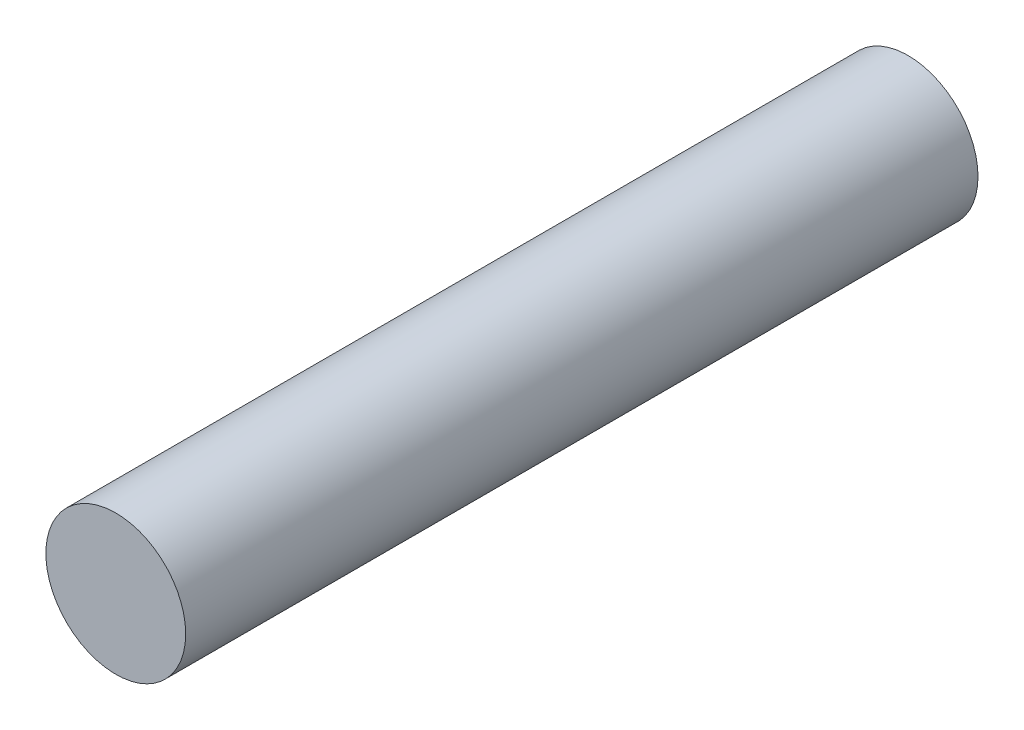
ISO-10303-21;
HEADER;
FILE_DESCRIPTION(('STEP AP214'),'2;1');
FILE_NAME('part.step','',(''),(''),'','','');
FILE_SCHEMA(('AUTOMOTIVE_DESIGN { 1 0 10303 214 1 1 1 1 }'));
ENDSEC;
DATA;
#1=APPLICATION_CONTEXT('core data for automotive mechanical design processes');
#2=APPLICATION_PROTOCOL_DEFINITION('international standard','automotive_design',2000,#1);
#3=PRODUCT_CONTEXT('',#1,'mechanical');
#4=PRODUCT('Part','Part','',(#3));
#5=PRODUCT_RELATED_PRODUCT_CATEGORY('part','',(#4));
#6=PRODUCT_DEFINITION_FORMATION('','',#4);
#7=PRODUCT_DEFINITION_CONTEXT('part definition',#1,'design');
#8=PRODUCT_DEFINITION('design','',#6,#7);
#9=PRODUCT_DEFINITION_SHAPE('','',#8);
#10=(LENGTH_UNIT() NAMED_UNIT(*) SI_UNIT(.MILLI.,.METRE.));
#11=(NAMED_UNIT(*) PLANE_ANGLE_UNIT() SI_UNIT($,.RADIAN.));
#12=(NAMED_UNIT(*) SI_UNIT($,.STERADIAN.) SOLID_ANGLE_UNIT());
#13=UNCERTAINTY_MEASURE_WITH_UNIT(LENGTH_MEASURE(1.E-05),#10,'distance_accuracy_value','');
#14=(GEOMETRIC_REPRESENTATION_CONTEXT(3) GLOBAL_UNCERTAINTY_ASSIGNED_CONTEXT((#13)) GLOBAL_UNIT_ASSIGNED_CONTEXT((#10,
#11,#12)) REPRESENTATION_CONTEXT('',''));
#15=CARTESIAN_POINT('',(0.,0.,0.));
#16=DIRECTION('',(0.,0.,1.));
#17=DIRECTION('',(1.,0.,0.));
#18=AXIS2_PLACEMENT_3D('',#15,#16,#17);
#19=CARTESIAN_POINT('',(29.,29.,0.));
#20=DIRECTION('',(0.,0.,1.));
#21=DIRECTION('',(1.,0.,0.));
#22=AXIS2_PLACEMENT_3D('',#19,#20,#21);
#23=PLANE('',#22);
#24=CARTESIAN_POINT('',(29.,29.,0.));
#25=DIRECTION('',(0.,0.,1.));
#26=DIRECTION('',(1.,0.,0.));
#27=AXIS2_PLACEMENT_3D('',#24,#25,#26);
#28=CIRCLE('',#27,3.);
#29=CARTESIAN_POINT('',(32.,29.,0.));
#30=VERTEX_POINT('',#29);
#31=EDGE_CURVE('E10',#30,#30,#28,.T.);
#32=ORIENTED_EDGE('',*,*,#31,.F.);
#33=EDGE_LOOP('',(#32));
#34=FACE_BOUND('',#33,.T.);
#35=ADVANCED_FACE('F16',(#34),#23,.F.);
#36=CARTESIAN_POINT('',(29.,29.,34.));
#37=DIRECTION('',(0.,0.,1.));
#38=DIRECTION('',(1.,0.,0.));
#39=AXIS2_PLACEMENT_3D('',#36,#37,#38);
#40=PLANE('',#39);
#41=CARTESIAN_POINT('',(29.,29.,34.));
#42=DIRECTION('',(0.,0.,1.));
#43=DIRECTION('',(1.,0.,0.));
#44=AXIS2_PLACEMENT_3D('',#41,#42,#43);
#45=CIRCLE('',#44,3.);
#46=CARTESIAN_POINT('',(32.,29.,34.));
#47=VERTEX_POINT('',#46);
#48=EDGE_CURVE('E40',#47,#47,#45,.T.);
#49=ORIENTED_EDGE('',*,*,#48,.T.);
#50=EDGE_LOOP('',(#49));
#51=FACE_BOUND('',#50,.T.);
#52=ADVANCED_FACE('F43',(#51),#40,.T.);
#53=CARTESIAN_POINT('',(29.,29.,0.));
#54=DIRECTION('',(0.,0.,1.));
#55=DIRECTION('',(1.,0.,0.));
#56=AXIS2_PLACEMENT_3D('',#53,#54,#55);
#57=CYLINDRICAL_SURFACE('',#56,3.);
#58=ORIENTED_EDGE('',*,*,#48,.F.);
#59=DIRECTION('',(0.,0.,1.));
#60=VECTOR('',#59,1.);
#61=CARTESIAN_POINT('',(32.,29.,0.));
#62=LINE('',#61,#60);
#63=EDGE_CURVE('E25',#30,#47,#62,.T.);
#64=ORIENTED_EDGE('',*,*,#63,.F.);
#65=ORIENTED_EDGE('',*,*,#31,.T.);
#66=ORIENTED_EDGE('',*,*,#63,.T.);
#67=EDGE_LOOP('',(#58,#64,#65,#66));
#68=FACE_BOUND('',#67,.T.);
#69=ADVANCED_FACE('F39',(#68),#57,.T.);
#70=CLOSED_SHELL('',(#35,#52,#69));
#71=MANIFOLD_SOLID_BREP('B1',#70);
#72=ADVANCED_BREP_SHAPE_REPRESENTATION('',(#18,#71),#14);
#73=SHAPE_DEFINITION_REPRESENTATION(#9,#72);
ENDSEC;
END-ISO-10303-21;
